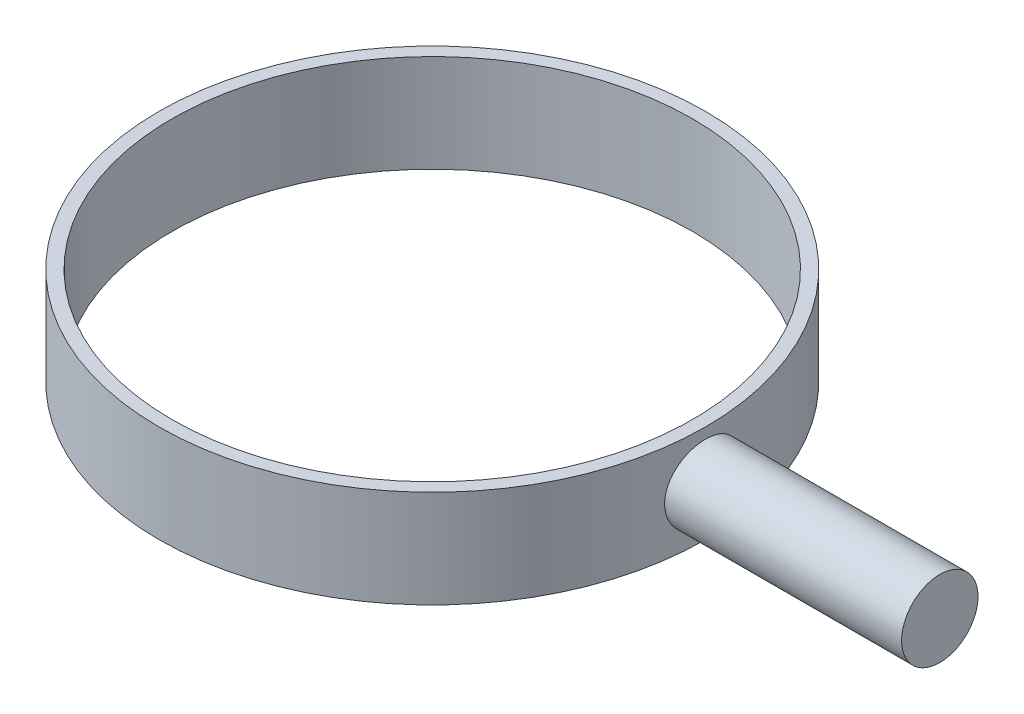
ISO-10303-21;
HEADER;
FILE_DESCRIPTION(('STEP AP214'),'2;1');
FILE_NAME('part.step','',(''),(''),'','','');
FILE_SCHEMA(('AUTOMOTIVE_DESIGN { 1 0 10303 214 1 1 1 1 }'));
ENDSEC;
DATA;
#1=APPLICATION_CONTEXT('core data for automotive mechanical design processes');
#2=APPLICATION_PROTOCOL_DEFINITION('international standard','automotive_design',2000,#1);
#3=PRODUCT_CONTEXT('',#1,'mechanical');
#4=PRODUCT('Part','Part','',(#3));
#5=PRODUCT_RELATED_PRODUCT_CATEGORY('part','',(#4));
#6=PRODUCT_DEFINITION_FORMATION('','',#4);
#7=PRODUCT_DEFINITION_CONTEXT('part definition',#1,'design');
#8=PRODUCT_DEFINITION('design','',#6,#7);
#9=PRODUCT_DEFINITION_SHAPE('','',#8);
#10=(LENGTH_UNIT() NAMED_UNIT(*) SI_UNIT(.MILLI.,.METRE.));
#11=(NAMED_UNIT(*) PLANE_ANGLE_UNIT() SI_UNIT($,.RADIAN.));
#12=(NAMED_UNIT(*) SI_UNIT($,.STERADIAN.) SOLID_ANGLE_UNIT());
#13=UNCERTAINTY_MEASURE_WITH_UNIT(LENGTH_MEASURE(1.E-05),#10,'distance_accuracy_value','');
#14=(GEOMETRIC_REPRESENTATION_CONTEXT(3) GLOBAL_UNCERTAINTY_ASSIGNED_CONTEXT((#13)) GLOBAL_UNIT_ASSIGNED_CONTEXT((#10,
#11,#12)) REPRESENTATION_CONTEXT('',''));
#15=CARTESIAN_POINT('',(0.,0.,0.));
#16=DIRECTION('',(0.,0.,1.));
#17=DIRECTION('',(1.,0.,0.));
#18=AXIS2_PLACEMENT_3D('',#15,#16,#17);
#19=CARTESIAN_POINT('',(0.,9.525,0.));
#20=DIRECTION('',(0.,-1.,0.));
#21=DIRECTION('',(0.,0.,-1.));
#22=AXIS2_PLACEMENT_3D('',#19,#20,#21);
#23=CYLINDRICAL_SURFACE('',#22,53.34);
#24=CARTESIAN_POINT('',(0.,-9.525,0.));
#25=DIRECTION('',(0.,1.,0.));
#26=DIRECTION('',(0.,0.,1.));
#27=AXIS2_PLACEMENT_3D('',#24,#25,#26);
#28=CIRCLE('',#27,53.34);
#29=CARTESIAN_POINT('',(0.,-9.525,53.34));
#30=VERTEX_POINT('',#29);
#31=EDGE_CURVE('E41',#30,#30,#28,.T.);
#32=ORIENTED_EDGE('',*,*,#31,.T.);
#33=EDGE_LOOP('',(#32));
#34=FACE_BOUND('',#33,.T.);
#35=CARTESIAN_POINT('',(0.,9.525,0.));
#36=DIRECTION('',(0.,1.,0.));
#37=DIRECTION('',(0.,0.,1.));
#38=AXIS2_PLACEMENT_3D('',#35,#36,#37);
#39=CIRCLE('',#38,53.34);
#40=CARTESIAN_POINT('',(0.,9.525,53.34));
#41=VERTEX_POINT('',#40);
#42=EDGE_CURVE('E45',#41,#41,#39,.T.);
#43=ORIENTED_EDGE('',*,*,#42,.F.);
#44=EDGE_LOOP('',(#43));
#45=FACE_BOUND('',#44,.T.);
#46=CARTESIAN_POINT('',(52.8162960546373,0.,7.45617));
#47=CARTESIAN_POINT('',(52.8162950368346,-0.208380192130052,7.45617264547601));
#48=CARTESIAN_POINT('',(52.8175317250136,-0.416722596473115,7.44743149143957));
#49=CARTESIAN_POINT('',(52.822440705884,-0.831980514425291,7.41253569596646));
#50=CARTESIAN_POINT('',(52.8261135284168,-1.03889570773262,7.38637726639526));
#51=CARTESIAN_POINT('',(52.8357935111177,-1.44989587619812,7.31681288945369));
#52=CARTESIAN_POINT('',(52.8418023261274,-1.65397873851635,7.27339471460553));
#53=CARTESIAN_POINT('',(52.8559827826826,-2.05779458210851,7.16961823616991));
#54=CARTESIAN_POINT('',(52.8641552171184,-2.25752593960846,7.10925372185437));
#55=CARTESIAN_POINT('',(52.8824167389677,-2.65093255294642,6.97211409355378));
#56=CARTESIAN_POINT('',(52.8925036971644,-2.84461426077821,6.89535719841624));
#57=CARTESIAN_POINT('',(52.9143164096685,-3.22487215893745,6.72592096783679));
#58=CARTESIAN_POINT('',(52.9260427674228,-3.41144570049137,6.63323576644641));
#59=CARTESIAN_POINT('',(52.9507924378506,-3.7760237665115,6.43268046427595));
#60=CARTESIAN_POINT('',(52.963815059808,-3.95403278037761,6.32481843794656));
#61=CARTESIAN_POINT('',(52.9908010309343,-4.30042996515855,6.09459093063637));
#62=CARTESIAN_POINT('',(53.0047647280504,-4.46881453459529,5.97222007241573));
#63=CARTESIAN_POINT('',(53.0333211981608,-4.79569582183868,5.71310121602987));
#64=CARTESIAN_POINT('',(53.0479171792802,-4.95412878276024,5.57627313527603));
#65=CARTESIAN_POINT('',(53.0772550078126,-5.25898318279834,5.28973939282006));
#66=CARTESIAN_POINT('',(53.0919969071954,-5.40540015619046,5.14002898538506));
#67=CARTESIAN_POINT('',(53.1212020125504,-5.68509617698458,4.82886139237959));
#68=CARTESIAN_POINT('',(53.1356653047491,-5.81837934349821,4.6674079175363));
#69=CARTESIAN_POINT('',(53.1639171592882,-6.0709737217027,4.33376800411498));
#70=CARTESIAN_POINT('',(53.1777054708229,-6.19027976244857,4.16157762921014));
#71=CARTESIAN_POINT('',(53.2042670217075,-6.41446362717425,3.80700625042392));
#72=CARTESIAN_POINT('',(53.2170360012483,-6.51928211772907,3.62458740435349));
#73=CARTESIAN_POINT('',(53.2411353887171,-6.71316814549156,3.25146846416551));
#74=CARTESIAN_POINT('',(53.2524657817387,-6.80223551949275,3.06076828426573));
#75=CARTESIAN_POINT('',(53.2733650062334,-6.96395891853666,2.67244852397238));
#76=CARTESIAN_POINT('',(53.2829339271721,-7.03661577711644,2.47482929560624));
#77=CARTESIAN_POINT('',(53.300038017281,-7.16498247053293,2.07407073494805));
#78=CARTESIAN_POINT('',(53.3075731532787,-7.22069202894954,1.87093131267736));
#79=CARTESIAN_POINT('',(53.3203505650546,-7.31442409756519,1.46197815075021));
#80=CARTESIAN_POINT('',(53.3256079001759,-7.35256288402939,1.25619153523931));
#81=CARTESIAN_POINT('',(53.3337558785269,-7.41142593848826,0.842026359640528));
#82=CARTESIAN_POINT('',(53.3366457033134,-7.43214418430482,0.633646928472867));
#83=CARTESIAN_POINT('',(53.3399712862825,-7.45597512623331,0.215933966543888));
#84=CARTESIAN_POINT('',(53.340408034312,-7.45909492353995,0.00660085473496645));
#85=CARTESIAN_POINT('',(53.338823197407,-7.44774446038604,-0.41159951459022));
#86=CARTESIAN_POINT('',(53.3368007070898,-7.43326772166051,-0.6204665721577));
#87=CARTESIAN_POINT('',(53.3271494222946,-7.36385133419318,-1.24103453128282));
#88=CARTESIAN_POINT('',(53.3159624865192,-7.28311464944182,-1.65010937950827));
#89=CARTESIAN_POINT('',(53.2852702637391,-7.05488758653431,-2.44861922451789));
#90=CARTESIAN_POINT('',(53.2657647860425,-6.90739567809559,-2.83805377084448));
#91=CARTESIAN_POINT('',(53.2205165792377,-6.54933508745162,-3.58800898791858));
#92=CARTESIAN_POINT('',(53.1947533689295,-6.33855873276439,-3.94842943128776));
#93=CARTESIAN_POINT('',(53.1398643414997,-5.8600644607061,-4.62895224766281));
#94=CARTESIAN_POINT('',(53.110738331856,-5.59234328247514,-4.9490523101105));
#95=CARTESIAN_POINT('',(53.0520835080895,-5.00483691092493,-5.5427382148536));
#96=CARTESIAN_POINT('',(53.0225533785781,-4.68462643824302,-5.81590328545268));
#97=CARTESIAN_POINT('',(52.9666623877279,-4.00268286271327,-6.30468009098467));
#98=CARTESIAN_POINT('',(52.9403015413602,-3.64094956373523,-6.52029155405111));
#99=CARTESIAN_POINT('',(52.893734589085,-2.88581745815819,-6.88788492766921));
#100=CARTESIAN_POINT('',(52.8735322707428,-2.49239935229016,-7.0398277026768));
#101=CARTESIAN_POINT('',(52.8416395807097,-1.68528464086598,-7.27536844449244));
#102=CARTESIAN_POINT('',(52.8299486915082,-1.27158926983807,-7.35897056657753));
#103=CARTESIAN_POINT('',(52.8164992965083,-0.439395728953199,-7.45488872235291));
#104=CARTESIAN_POINT('',(52.8146579387083,-0.0209673888442501,-7.4677994179607));
#105=CARTESIAN_POINT('',(52.8208965821332,0.812082304643628,-7.42354106791346));
#106=CARTESIAN_POINT('',(52.8289763172469,1.22670375983328,-7.36637390194193));
#107=CARTESIAN_POINT('',(52.8540705765902,2.03855073943039,-7.18409001750314));
#108=CARTESIAN_POINT('',(52.8710466074723,2.43584328377961,-7.0592659641956));
#109=CARTESIAN_POINT('',(52.9119903346672,3.20387202564418,-6.74549754346714));
#110=CARTESIAN_POINT('',(52.9359583340077,3.57460707130625,-6.55655039693269));
#111=CARTESIAN_POINT('',(52.9883777992562,4.28163106495717,-6.11852023333054));
#112=CARTESIAN_POINT('',(53.0168576751885,4.61767781039945,-5.86905044233086));
#113=CARTESIAN_POINT('',(53.0750207311018,5.24346552926374,-5.31735810941838));
#114=CARTESIAN_POINT('',(53.1047039698708,5.53320423697265,-5.01513298785846));
#115=CARTESIAN_POINT('',(53.1477350405827,5.92772554171653,-4.52778932557819));
#116=CARTESIAN_POINT('',(53.1618844805155,6.05298006200625,-4.35891307973981));
#117=CARTESIAN_POINT('',(53.1892523490044,6.28881029502142,-4.01115831264894));
#118=CARTESIAN_POINT('',(53.2024711194964,6.39939141223161,-3.83228350874317));
#119=CARTESIAN_POINT('',(53.2276076697027,6.60511378037446,-3.46571135232437));
#120=CARTESIAN_POINT('',(53.2395249968782,6.70024966624131,-3.27801096322293));
#121=CARTESIAN_POINT('',(53.2617123197666,6.87432341177354,-2.89522563005714));
#122=CARTESIAN_POINT('',(53.2719829020733,6.95326704216008,-2.70014334627141));
#123=CARTESIAN_POINT('',(53.2905601901776,7.09419089805436,-2.30453547477651));
#124=CARTESIAN_POINT('',(53.2988728664502,7.15622278811758,-2.10402857010502));
#125=CARTESIAN_POINT('',(53.3133389404918,7.26318048121371,-1.69843032278005));
#126=CARTESIAN_POINT('',(53.319492388752,7.30810668424641,-1.49333908744542));
#127=CARTESIAN_POINT('',(53.3294648082919,7.38051324690559,-1.08004949453051));
#128=CARTESIAN_POINT('',(53.3332838476114,7.40799411500408,-0.871851227690651));
#129=CARTESIAN_POINT('',(53.3384786311427,7.44530163372309,-0.453852237074265));
#130=CARTESIAN_POINT('',(53.3398544279737,7.45512866454824,-0.244051547906283));
#131=CARTESIAN_POINT('',(53.3401225067877,7.45704633087387,0.173878624760172));
#132=CARTESIAN_POINT('',(53.3390354321861,7.44928439432517,0.382007433514934));
#133=CARTESIAN_POINT('',(53.334451628708,7.41639170892889,0.796787830402289));
#134=CARTESIAN_POINT('',(53.3309557453825,7.39126705481217,1.00343991119242));
#135=CARTESIAN_POINT('',(53.3216524592155,7.32383814736342,1.4139063954124));
#136=CARTESIAN_POINT('',(53.3158446433428,7.28153082428664,1.61772028505642));
#137=CARTESIAN_POINT('',(53.3020803200236,7.18005303674518,2.02102627192606));
#138=CARTESIAN_POINT('',(53.294123857126,7.12088292190227,2.22051845866271));
#139=CARTESIAN_POINT('',(53.2762892569906,6.98615204631673,2.61367730624727));
#140=CARTESIAN_POINT('',(53.266412170845,6.91060024812456,2.80734708686725));
#141=CARTESIAN_POINT('',(53.2450082826053,6.74363613790961,3.187626890549));
#142=CARTESIAN_POINT('',(53.2334814944792,6.65222396017406,3.37423697336777));
#143=CARTESIAN_POINT('',(53.2090951960427,6.45417206324439,3.73914953059529));
#144=CARTESIAN_POINT('',(53.1962354215375,6.3475293238002,3.91745034793713));
#145=CARTESIAN_POINT('',(53.1695455558694,6.11982192709959,4.26442211912482));
#146=CARTESIAN_POINT('',(53.1557158120516,5.99876242174358,4.43309648134623));
#147=CARTESIAN_POINT('',(53.1273430417105,5.74193962979975,4.76113011640976));
#148=CARTESIAN_POINT('',(53.1127949383332,5.60605975967414,4.92039768885211));
#149=CARTESIAN_POINT('',(53.0835096293699,5.32145542524605,5.22688254598093));
#150=CARTESIAN_POINT('',(53.068772493909,5.17273561317454,5.37410415787474));
#151=CARTESIAN_POINT('',(53.0395092589378,4.86334633192511,5.65562582441284));
#152=CARTESIAN_POINT('',(53.0249832919477,4.70266971596089,5.7899180391478));
#153=CARTESIAN_POINT('',(52.996566857057,4.37061966983182,6.04449381792994));
#154=CARTESIAN_POINT('',(52.9826761565079,4.19925021087195,6.16478253571668));
#155=CARTESIAN_POINT('',(52.9558482868882,3.84602456878621,6.39114989386518));
#156=CARTESIAN_POINT('',(52.9429164837336,3.66411823549335,6.49715093941837));
#157=CARTESIAN_POINT('',(52.9184643807563,3.29199007405951,6.69339269857453));
#158=CARTESIAN_POINT('',(52.9069435629884,3.1017713322418,6.78363920056947));
#159=CARTESIAN_POINT('',(52.8856500110342,2.71444216452058,6.94769521643973));
#160=CARTESIAN_POINT('',(52.8758759598999,2.51733706566687,7.0215171237612));
#161=CARTESIAN_POINT('',(52.8583518792752,2.1175762029445,7.15224254904776));
#162=CARTESIAN_POINT('',(52.8506013857607,1.91492172340741,7.20914994611164));
#163=CARTESIAN_POINT('',(52.8349223507392,1.43036741088522,7.32332528732722));
#164=CARTESIAN_POINT('',(52.8279687123555,1.14663375487865,7.37308825062446));
#165=CARTESIAN_POINT('',(52.818656290688,0.575242714036761,7.43950860817989));
#166=CARTESIAN_POINT('',(52.8162974593062,0.287585370305955,7.45616634898024));
#167=CARTESIAN_POINT('',(52.8162960546373,0.,7.45617));
#168=B_SPLINE_CURVE_WITH_KNOTS('',3,(#46,#47,#48,#49,#50,#51,#52,#53,#54,#55,#56,#57,#58,#59,
#60,#61,#62,#63,#64,#65,#66,#67,#68,#69,#70,#71,#72,#73,#74,#75,#76,#77,#78,#79,#80,#81,#82,#83,
#84,#85,#86,#87,#88,#89,#90,#91,#92,#93,#94,#95,#96,#97,#98,#99,#100,#101,#102,#103,#104,#105,
#106,#107,#108,#109,#110,#111,#112,#113,#114,#115,#116,#117,#118,#119,#120,#121,#122,#123,#124,
#125,#126,#127,#128,#129,#130,#131,#132,#133,#134,#135,#136,#137,#138,#139,#140,#141,#142,#143,
#144,#145,#146,#147,#148,#149,#150,#151,#152,#153,#154,#155,#156,#157,#158,#159,#160,#161,#162,
#163,#164,#165,#166,#167),.UNSPECIFIED.,.T.,.F.,(4,2,2,2,2,2,2,2,2,2,2,2,2,2,2,2,2,2,2,2,2,2,2,
2,2,2,2,2,2,2,2,2,2,2,2,2,2,2,2,2,2,2,2,2,2,2,2,2,2,2,2,2,2,2,2,2,2,2,2,2,4),(0.,
0.624888716967719,1.24991338723555,1.87538164077056,2.50107942446335,3.12608537988635,
3.75132200266005,4.37622723289301,5.00136479274004,5.63016733543956,6.25920252325278,
6.88803979675614,7.51710898364676,8.14868265404994,8.78026286817175,9.41181099530846,
10.0433694228016,10.6706861991327,11.2982197461177,11.9255000573227,12.5530113753117,
13.7979268399335,15.0428708441788,16.2919457230573,17.5410921476008,18.8009109647767,
20.0607357328645,21.3213337516813,22.5818551173862,23.8317563965993,25.0816241507109,
26.3261279730069,27.5706857393503,28.8234167347486,30.0762090037583,30.7077881607672,
31.3391340459921,31.9706987688792,32.6020380172568,33.2314263738591,33.8608000119252,
34.4901553050539,35.1194970438114,35.7435832699476,36.3674505380318,36.9914293112775,
37.6153951483082,38.239020466144,38.8626405041045,39.4863843792857,40.1099060217169,
40.7387447587413,41.3673566003997,41.9963472396584,42.6251056532709,43.2571518985506,
43.8889654321226,44.5203005913036,45.1514908509639,46.0139083986016,46.8763169184911),.UNSPECIFIED.);
#169=CARTESIAN_POINT('',(52.8162960546373,0.,7.45617));
#170=VERTEX_POINT('',#169);
#171=EDGE_CURVE('E10',#170,#170,#168,.T.);
#172=ORIENTED_EDGE('',*,*,#171,.F.);
#173=EDGE_LOOP('',(#172));
#174=FACE_BOUND('',#173,.T.);
#175=ADVANCED_FACE('F37',(#34,#45,#174),#23,.T.);
#176=CARTESIAN_POINT('',(0.,9.525,0.));
#177=DIRECTION('',(0.,-1.,0.));
#178=DIRECTION('',(0.,0.,-1.));
#179=AXIS2_PLACEMENT_3D('',#176,#177,#178);
#180=CYLINDRICAL_SURFACE('',#179,50.8254);
#181=CARTESIAN_POINT('',(0.,-9.525,0.));
#182=DIRECTION('',(0.,1.,0.));
#183=DIRECTION('',(0.,0.,1.));
#184=AXIS2_PLACEMENT_3D('',#181,#182,#183);
#185=CIRCLE('',#184,50.8254);
#186=CARTESIAN_POINT('',(0.,-9.525,-50.8254));
#187=VERTEX_POINT('',#186);
#188=EDGE_CURVE('E92',#187,#187,#185,.T.);
#189=CARTESIAN_POINT('',(0.,9.525,0.));
#190=DIRECTION('',(0.,1.,0.));
#191=DIRECTION('',(0.,0.,1.));
#192=AXIS2_PLACEMENT_3D('',#189,#190,#191);
#193=CIRCLE('',#192,50.8254);
#194=CARTESIAN_POINT('',(0.,9.525,-50.8254));
#195=VERTEX_POINT('',#194);
#196=EDGE_CURVE('E57',#195,#195,#193,.T.);
#197=CARTESIAN_POINT('',(0.,-9.525,-50.8254));
#198=CARTESIAN_POINT('',(0.,-9.3265625,-50.8254));
#199=CARTESIAN_POINT('',(0.,-9.128125,-50.8254));
#200=CARTESIAN_POINT('',(0.,-8.73125,-50.8254));
#201=CARTESIAN_POINT('',(0.,-8.5328125,-50.8254));
#202=CARTESIAN_POINT('',(0.,-8.1359375,-50.8254));
#203=CARTESIAN_POINT('',(0.,-7.9375,-50.8254));
#204=CARTESIAN_POINT('',(0.,-7.540625,-50.8254));
#205=CARTESIAN_POINT('',(0.,-7.3421875,-50.8254));
#206=CARTESIAN_POINT('',(0.,-6.9453125,-50.8254));
#207=CARTESIAN_POINT('',(0.,-6.746875,-50.8254));
#208=CARTESIAN_POINT('',(0.,-6.35,-50.8254));
#209=CARTESIAN_POINT('',(0.,-6.1515625,-50.8254));
#210=CARTESIAN_POINT('',(0.,-5.7546875,-50.8254));
#211=CARTESIAN_POINT('',(0.,-5.55625,-50.8254));
#212=CARTESIAN_POINT('',(0.,-5.159375,-50.8254));
#213=CARTESIAN_POINT('',(0.,-4.9609375,-50.8254));
#214=CARTESIAN_POINT('',(0.,-4.5640625,-50.8254));
#215=CARTESIAN_POINT('',(0.,-4.365625,-50.8254));
#216=CARTESIAN_POINT('',(0.,-3.96875,-50.8254));
#217=CARTESIAN_POINT('',(0.,-3.7703125,-50.8254));
#218=CARTESIAN_POINT('',(0.,-3.3734375,-50.8254));
#219=CARTESIAN_POINT('',(0.,-3.175,-50.8254));
#220=CARTESIAN_POINT('',(0.,-2.778125,-50.8254));
#221=CARTESIAN_POINT('',(0.,-2.5796875,-50.8254));
#222=CARTESIAN_POINT('',(0.,-2.1828125,-50.8254));
#223=CARTESIAN_POINT('',(0.,-1.984375,-50.8254));
#224=CARTESIAN_POINT('',(0.,-1.5875,-50.8254));
#225=CARTESIAN_POINT('',(0.,-1.3890625,-50.8254));
#226=CARTESIAN_POINT('',(0.,-0.992187500000001,-50.8254));
#227=CARTESIAN_POINT('',(0.,-0.793750000000001,-50.8254));
#228=CARTESIAN_POINT('',(0.,-0.396875,-50.8254));
#229=CARTESIAN_POINT('',(0.,-0.1984375,-50.8254));
#230=CARTESIAN_POINT('',(0.,0.1984375,-50.8254));
#231=CARTESIAN_POINT('',(0.,0.396875,-50.8254));
#232=CARTESIAN_POINT('',(0.,0.793750000000001,-50.8254));
#233=CARTESIAN_POINT('',(0.,0.9921875,-50.8254));
#234=CARTESIAN_POINT('',(0.,1.3890625,-50.8254));
#235=CARTESIAN_POINT('',(0.,1.5875,-50.8254));
#236=CARTESIAN_POINT('',(0.,1.984375,-50.8254));
#237=CARTESIAN_POINT('',(0.,2.1828125,-50.8254));
#238=CARTESIAN_POINT('',(0.,2.5796875,-50.8254));
#239=CARTESIAN_POINT('',(0.,2.778125,-50.8254));
#240=CARTESIAN_POINT('',(0.,3.175,-50.8254));
#241=CARTESIAN_POINT('',(0.,3.3734375,-50.8254));
#242=CARTESIAN_POINT('',(0.,3.7703125,-50.8254));
#243=CARTESIAN_POINT('',(0.,3.96875,-50.8254));
#244=CARTESIAN_POINT('',(0.,4.365625,-50.8254));
#245=CARTESIAN_POINT('',(0.,4.5640625,-50.8254));
#246=CARTESIAN_POINT('',(0.,4.9609375,-50.8254));
#247=CARTESIAN_POINT('',(0.,5.159375,-50.8254));
#248=CARTESIAN_POINT('',(0.,5.55625,-50.8254));
#249=CARTESIAN_POINT('',(0.,5.7546875,-50.8254));
#250=CARTESIAN_POINT('',(0.,6.1515625,-50.8254));
#251=CARTESIAN_POINT('',(0.,6.35,-50.8254));
#252=CARTESIAN_POINT('',(0.,6.746875,-50.8254));
#253=CARTESIAN_POINT('',(0.,6.9453125,-50.8254));
#254=CARTESIAN_POINT('',(0.,7.3421875,-50.8254));
#255=CARTESIAN_POINT('',(0.,7.540625,-50.8254));
#256=CARTESIAN_POINT('',(0.,7.9375,-50.8254));
#257=CARTESIAN_POINT('',(0.,8.1359375,-50.8254));
#258=CARTESIAN_POINT('',(0.,8.5328125,-50.8254));
#259=CARTESIAN_POINT('',(0.,8.73125,-50.8254));
#260=CARTESIAN_POINT('',(0.,9.128125,-50.8254));
#261=CARTESIAN_POINT('',(0.,9.3265625,-50.8254));
#262=CARTESIAN_POINT('',(0.,9.525,-50.8254));
#263=B_SPLINE_CURVE_WITH_KNOTS('',3,(#197,#198,#199,#200,#201,#202,#203,#204,#205,#206,#207,
#208,#209,#210,#211,#212,#213,#214,#215,#216,#217,#218,#219,#220,#221,#222,#223,#224,#225,#226,
#227,#228,#229,#230,#231,#232,#233,#234,#235,#236,#237,#238,#239,#240,#241,#242,#243,#244,#245,
#246,#247,#248,#249,#250,#251,#252,#253,#254,#255,#256,#257,#258,#259,#260,#261,#262),
.UNSPECIFIED.,.F.,.F.,(4,2,2,2,2,2,2,2,2,2,2,2,2,2,2,2,2,2,2,2,2,2,2,2,2,2,2,2,2,2,2,2,4),(0.,
0.5953125,1.190625,1.7859375,2.38125,2.9765625,3.571875,4.1671875,4.7625,5.3578125,5.953125,
6.5484375,7.14375,7.7390625,8.334375,8.9296875,9.525,10.1203125,10.715625,11.3109375,11.90625,
12.5015625,13.096875,13.6921875,14.2875,14.8828125,15.478125,16.0734375,16.66875,17.2640625,
17.859375,18.4546875,19.05),.UNSPECIFIED.);
#264=EDGE_CURVE('BSEAM67',#187,#195,#263,.T.);
#265=ORIENTED_EDGE('',*,*,#188,.F.);
#266=ORIENTED_EDGE('',*,*,#196,.T.);
#267=ORIENTED_EDGE('',*,*,#264,.T.);
#268=ORIENTED_EDGE('',*,*,#264,.F.);
#269=EDGE_LOOP('',(#265,#267,#266,#268));
#270=FACE_BOUND('',#269,.T.);
#271=ADVANCED_FACE('F67',(#270),#180,.F.);
#272=CARTESIAN_POINT('',(0.,9.525,0.));
#273=DIRECTION('',(0.,1.,0.));
#274=DIRECTION('',(0.,0.,1.));
#275=AXIS2_PLACEMENT_3D('',#272,#273,#274);
#276=PLANE('',#275);
#277=ORIENTED_EDGE('',*,*,#42,.T.);
#278=EDGE_LOOP('',(#277));
#279=FACE_BOUND('',#278,.T.);
#280=ORIENTED_EDGE('',*,*,#196,.F.);
#281=EDGE_LOOP('',(#280));
#282=FACE_BOUND('',#281,.T.);
#283=ADVANCED_FACE('F70',(#279,#282),#276,.T.);
#284=CARTESIAN_POINT('',(0.,-9.525,0.));
#285=DIRECTION('',(0.,1.,0.));
#286=DIRECTION('',(0.,0.,1.));
#287=AXIS2_PLACEMENT_3D('',#284,#285,#286);
#288=PLANE('',#287);
#289=ORIENTED_EDGE('',*,*,#31,.F.);
#290=EDGE_LOOP('',(#289));
#291=FACE_BOUND('',#290,.T.);
#292=ORIENTED_EDGE('',*,*,#188,.T.);
#293=EDGE_LOOP('',(#292));
#294=FACE_BOUND('',#293,.T.);
#295=ADVANCED_FACE('F65',(#291,#294),#288,.F.);
#296=CARTESIAN_POINT('',(99.06,0.,0.));
#297=DIRECTION('',(-1.,0.,0.));
#298=DIRECTION('',(0.,0.,1.));
#299=AXIS2_PLACEMENT_3D('',#296,#297,#298);
#300=CYLINDRICAL_SURFACE('',#299,7.45617);
#301=CARTESIAN_POINT('',(99.06,0.,0.));
#302=DIRECTION('',(1.,0.,0.));
#303=DIRECTION('',(0.,0.,-1.));
#304=AXIS2_PLACEMENT_3D('',#301,#302,#303);
#305=CIRCLE('',#304,7.45617);
#306=CARTESIAN_POINT('',(99.06,0.,-7.45617));
#307=VERTEX_POINT('',#306);
#308=EDGE_CURVE('E56',#307,#307,#305,.T.);
#309=ORIENTED_EDGE('',*,*,#308,.F.);
#310=EDGE_LOOP('',(#309));
#311=FACE_BOUND('',#310,.T.);
#312=ORIENTED_EDGE('',*,*,#171,.T.);
#313=EDGE_LOOP('',(#312));
#314=FACE_BOUND('',#313,.T.);
#315=ADVANCED_FACE('F59',(#311,#314),#300,.T.);
#316=CARTESIAN_POINT('',(99.06,0.,0.));
#317=DIRECTION('',(1.,0.,0.));
#318=DIRECTION('',(0.,0.,-1.));
#319=AXIS2_PLACEMENT_3D('',#316,#317,#318);
#320=PLANE('',#319);
#321=ORIENTED_EDGE('',*,*,#308,.T.);
#322=EDGE_LOOP('',(#321));
#323=FACE_BOUND('',#322,.T.);
#324=ADVANCED_FACE('F64',(#323),#320,.T.);
#325=CLOSED_SHELL('',(#175,#271,#283,#295,#315,#324));
#326=MANIFOLD_SOLID_BREP('B2',#325);
#327=ADVANCED_BREP_SHAPE_REPRESENTATION('',(#18,#326),#14);
#328=SHAPE_DEFINITION_REPRESENTATION(#9,#327);
ENDSEC;
END-ISO-10303-21;
